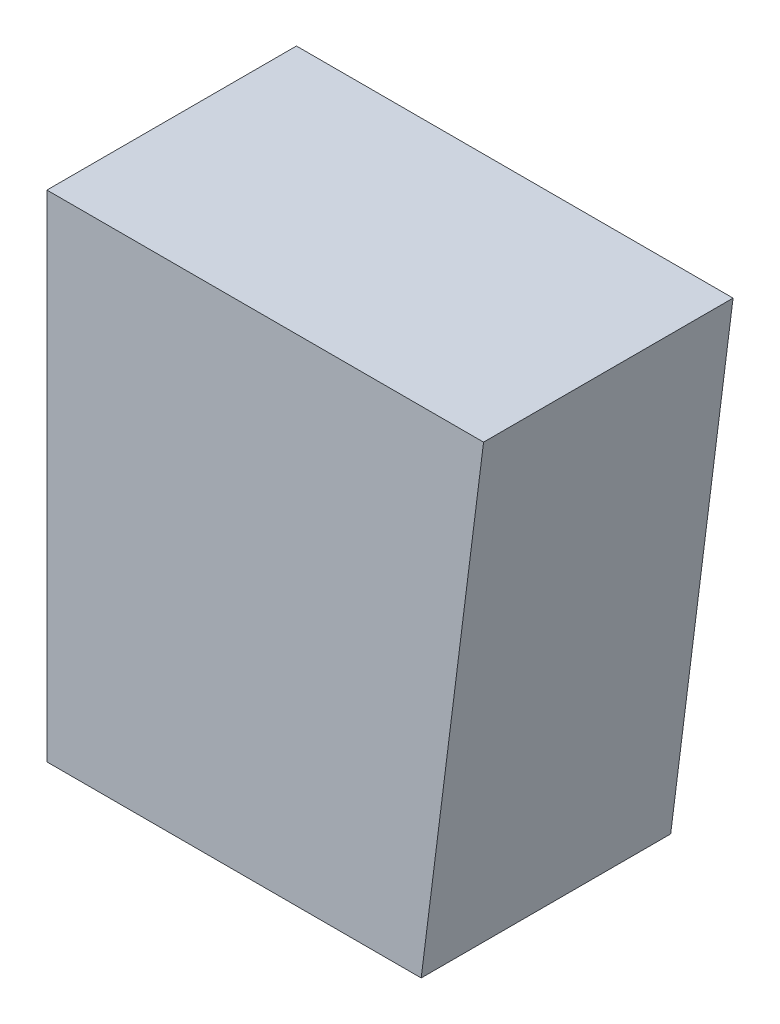
ISO-10303-21;
HEADER;
FILE_DESCRIPTION(('STEP AP214'),'2;1');
FILE_NAME('part.step','',(''),(''),'','','');
FILE_SCHEMA(('AUTOMOTIVE_DESIGN { 1 0 10303 214 1 1 1 1 }'));
ENDSEC;
DATA;
#1=APPLICATION_CONTEXT('core data for automotive mechanical design processes');
#2=APPLICATION_PROTOCOL_DEFINITION('international standard','automotive_design',2000,#1);
#3=PRODUCT_CONTEXT('',#1,'mechanical');
#4=PRODUCT('Part','Part','',(#3));
#5=PRODUCT_RELATED_PRODUCT_CATEGORY('part','',(#4));
#6=PRODUCT_DEFINITION_FORMATION('','',#4);
#7=PRODUCT_DEFINITION_CONTEXT('part definition',#1,'design');
#8=PRODUCT_DEFINITION('design','',#6,#7);
#9=PRODUCT_DEFINITION_SHAPE('','',#8);
#10=(LENGTH_UNIT() NAMED_UNIT(*) SI_UNIT(.MILLI.,.METRE.));
#11=(NAMED_UNIT(*) PLANE_ANGLE_UNIT() SI_UNIT($,.RADIAN.));
#12=(NAMED_UNIT(*) SI_UNIT($,.STERADIAN.) SOLID_ANGLE_UNIT());
#13=UNCERTAINTY_MEASURE_WITH_UNIT(LENGTH_MEASURE(1.E-05),#10,'distance_accuracy_value','');
#14=(GEOMETRIC_REPRESENTATION_CONTEXT(3) GLOBAL_UNCERTAINTY_ASSIGNED_CONTEXT((#13)) GLOBAL_UNIT_ASSIGNED_CONTEXT((#10,
#11,#12)) REPRESENTATION_CONTEXT('',''));
#15=CARTESIAN_POINT('',(0.,0.,0.));
#16=DIRECTION('',(0.,0.,1.));
#17=DIRECTION('',(1.,0.,0.));
#18=AXIS2_PLACEMENT_3D('',#15,#16,#17);
#19=CARTESIAN_POINT('',(0.,10.0838,5.08));
#20=DIRECTION('',(1.,0.,0.));
#21=DIRECTION('',(0.,1.,0.));
#22=AXIS2_PLACEMENT_3D('',#19,#20,#21);
#23=PLANE('',#22);
#24=DIRECTION('',(0.,-1.,0.));
#25=VECTOR('',#24,1.);
#26=CARTESIAN_POINT('',(0.,10.0838,0.));
#27=LINE('',#26,#25);
#28=CARTESIAN_POINT('',(0.,10.0838,0.));
#29=VERTEX_POINT('',#28);
#30=CARTESIAN_POINT('',(0.,0.,0.));
#31=VERTEX_POINT('',#30);
#32=EDGE_CURVE('E96',#29,#31,#27,.T.);
#33=ORIENTED_EDGE('',*,*,#32,.T.);
#34=DIRECTION('',(0.,0.,-1.));
#35=VECTOR('',#34,1.);
#36=CARTESIAN_POINT('',(0.,0.,5.08));
#37=LINE('',#36,#35);
#38=CARTESIAN_POINT('',(0.,0.,5.08));
#39=VERTEX_POINT('',#38);
#40=EDGE_CURVE('E11',#39,#31,#37,.T.);
#41=ORIENTED_EDGE('',*,*,#40,.F.);
#42=DIRECTION('',(0.,-1.,0.));
#43=VECTOR('',#42,1.);
#44=CARTESIAN_POINT('',(0.,10.0838,5.08));
#45=LINE('',#44,#43);
#46=CARTESIAN_POINT('',(0.,10.0838,5.08));
#47=VERTEX_POINT('',#46);
#48=EDGE_CURVE('E84',#47,#39,#45,.T.);
#49=ORIENTED_EDGE('',*,*,#48,.F.);
#50=DIRECTION('',(0.,0.,-1.));
#51=VECTOR('',#50,1.);
#52=CARTESIAN_POINT('',(0.,10.0838,5.08));
#53=LINE('',#52,#51);
#54=EDGE_CURVE('E92',#47,#29,#53,.T.);
#55=ORIENTED_EDGE('',*,*,#54,.T.);
#56=EDGE_LOOP('',(#33,#41,#49,#55));
#57=FACE_BOUND('',#56,.T.);
#58=ADVANCED_FACE('F33',(#57),#23,.F.);
#59=CARTESIAN_POINT('',(0.,0.,5.08));
#60=DIRECTION('',(0.,1.,0.));
#61=DIRECTION('',(0.,0.,1.));
#62=AXIS2_PLACEMENT_3D('',#59,#60,#61);
#63=PLANE('',#62);
#64=DIRECTION('',(1.,0.,0.));
#65=VECTOR('',#64,1.);
#66=CARTESIAN_POINT('',(0.,0.,0.));
#67=LINE('',#66,#65);
#68=CARTESIAN_POINT('',(7.62,0.,0.));
#69=VERTEX_POINT('',#68);
#70=EDGE_CURVE('E88',#31,#69,#67,.T.);
#71=ORIENTED_EDGE('',*,*,#70,.T.);
#72=DIRECTION('',(0.,0.,-1.));
#73=VECTOR('',#72,1.);
#74=CARTESIAN_POINT('',(7.62,0.,5.08));
#75=LINE('',#74,#73);
#76=CARTESIAN_POINT('',(7.62,0.,5.08));
#77=VERTEX_POINT('',#76);
#78=EDGE_CURVE('E41',#77,#69,#75,.T.);
#79=ORIENTED_EDGE('',*,*,#78,.F.);
#80=DIRECTION('',(1.,0.,0.));
#81=VECTOR('',#80,1.);
#82=CARTESIAN_POINT('',(0.,0.,5.08));
#83=LINE('',#82,#81);
#84=EDGE_CURVE('E79',#39,#77,#83,.T.);
#85=ORIENTED_EDGE('',*,*,#84,.F.);
#86=ORIENTED_EDGE('',*,*,#40,.T.);
#87=EDGE_LOOP('',(#71,#79,#85,#86));
#88=FACE_BOUND('',#87,.T.);
#89=ADVANCED_FACE('F87',(#88),#63,.F.);
#90=CARTESIAN_POINT('',(7.62,0.,5.08));
#91=DIRECTION('',(-0.992162102322297,0.124957443617418,0.));
#92=DIRECTION('',(-0.124957443617418,-0.992162102322297,0.));
#93=AXIS2_PLACEMENT_3D('',#90,#91,#92);
#94=PLANE('',#93);
#95=DIRECTION('',(0.124957443617418,0.992162102322297,0.));
#96=VECTOR('',#95,1.);
#97=CARTESIAN_POINT('',(7.62,0.,0.));
#98=LINE('',#97,#96);
#99=CARTESIAN_POINT('',(8.89,10.0838,0.));
#100=VERTEX_POINT('',#99);
#101=EDGE_CURVE('E66',#69,#100,#98,.T.);
#102=ORIENTED_EDGE('',*,*,#101,.T.);
#103=DIRECTION('',(0.,0.,-1.));
#104=VECTOR('',#103,1.);
#105=CARTESIAN_POINT('',(8.89,10.0838,5.08));
#106=LINE('',#105,#104);
#107=CARTESIAN_POINT('',(8.89,10.0838,5.08));
#108=VERTEX_POINT('',#107);
#109=EDGE_CURVE('E89',#108,#100,#106,.T.);
#110=ORIENTED_EDGE('',*,*,#109,.F.);
#111=DIRECTION('',(0.124957443617418,0.992162102322297,0.));
#112=VECTOR('',#111,1.);
#113=CARTESIAN_POINT('',(7.62,0.,5.08));
#114=LINE('',#113,#112);
#115=EDGE_CURVE('E82',#77,#108,#114,.T.);
#116=ORIENTED_EDGE('',*,*,#115,.F.);
#117=ORIENTED_EDGE('',*,*,#78,.T.);
#118=EDGE_LOOP('',(#102,#110,#116,#117));
#119=FACE_BOUND('',#118,.T.);
#120=ADVANCED_FACE('F90',(#119),#94,.F.);
#121=CARTESIAN_POINT('',(8.89,10.0838,5.08));
#122=DIRECTION('',(0.,-1.,0.));
#123=DIRECTION('',(0.,0.,-1.));
#124=AXIS2_PLACEMENT_3D('',#121,#122,#123);
#125=PLANE('',#124);
#126=DIRECTION('',(-1.,0.,0.));
#127=VECTOR('',#126,1.);
#128=CARTESIAN_POINT('',(8.89,10.0838,0.));
#129=LINE('',#128,#127);
#130=EDGE_CURVE('E72',#100,#29,#129,.T.);
#131=ORIENTED_EDGE('',*,*,#130,.T.);
#132=ORIENTED_EDGE('',*,*,#54,.F.);
#133=DIRECTION('',(-1.,0.,0.));
#134=VECTOR('',#133,1.);
#135=CARTESIAN_POINT('',(8.89,10.0838,5.08));
#136=LINE('',#135,#134);
#137=EDGE_CURVE('E49',#108,#47,#136,.T.);
#138=ORIENTED_EDGE('',*,*,#137,.F.);
#139=ORIENTED_EDGE('',*,*,#109,.T.);
#140=EDGE_LOOP('',(#131,#132,#138,#139));
#141=FACE_BOUND('',#140,.T.);
#142=ADVANCED_FACE('F103',(#141),#125,.F.);
#143=CARTESIAN_POINT('',(0.,0.,5.08));
#144=DIRECTION('',(0.,0.,1.));
#145=DIRECTION('',(1.,0.,0.));
#146=AXIS2_PLACEMENT_3D('',#143,#144,#145);
#147=PLANE('',#146);
#148=ORIENTED_EDGE('',*,*,#48,.T.);
#149=ORIENTED_EDGE('',*,*,#84,.T.);
#150=ORIENTED_EDGE('',*,*,#115,.T.);
#151=ORIENTED_EDGE('',*,*,#137,.T.);
#152=EDGE_LOOP('',(#148,#149,#150,#151));
#153=FACE_BOUND('',#152,.T.);
#154=ADVANCED_FACE('F80',(#153),#147,.T.);
#155=CARTESIAN_POINT('',(0.,0.,0.));
#156=DIRECTION('',(0.,0.,1.));
#157=DIRECTION('',(1.,0.,0.));
#158=AXIS2_PLACEMENT_3D('',#155,#156,#157);
#159=PLANE('',#158);
#160=ORIENTED_EDGE('',*,*,#32,.F.);
#161=ORIENTED_EDGE('',*,*,#130,.F.);
#162=ORIENTED_EDGE('',*,*,#101,.F.);
#163=ORIENTED_EDGE('',*,*,#70,.F.);
#164=EDGE_LOOP('',(#160,#161,#162,#163));
#165=FACE_BOUND('',#164,.T.);
#166=ADVANCED_FACE('F106',(#165),#159,.F.);
#167=CLOSED_SHELL('',(#58,#89,#120,#142,#154,#166));
#168=MANIFOLD_SOLID_BREP('B2',#167);
#169=ADVANCED_BREP_SHAPE_REPRESENTATION('',(#18,#168),#14);
#170=SHAPE_DEFINITION_REPRESENTATION(#9,#169);
ENDSEC;
END-ISO-10303-21;
